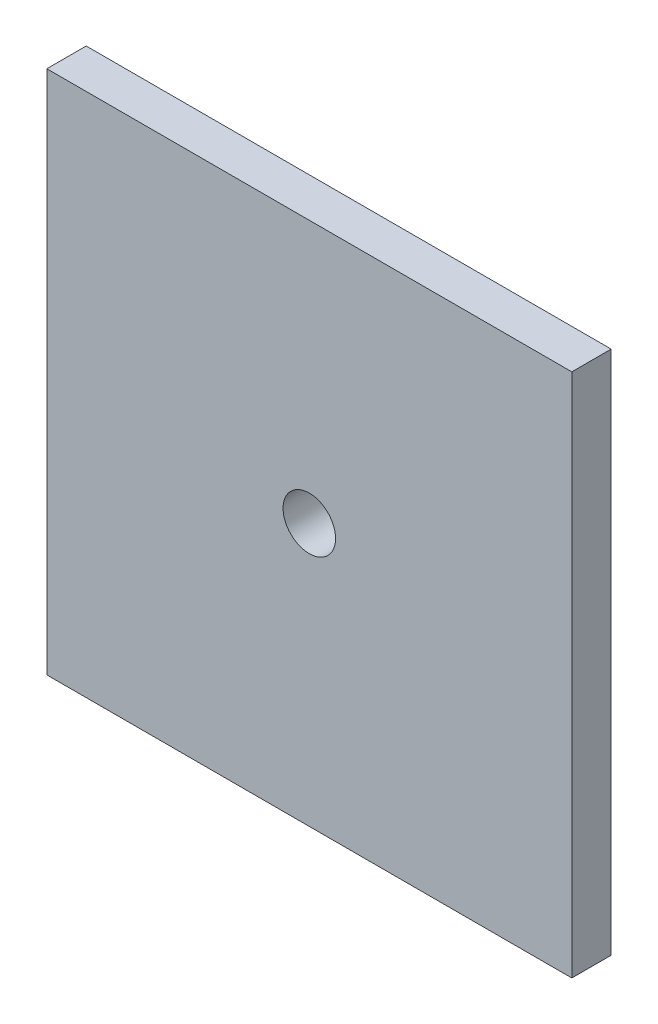
ISO-10303-21;
HEADER;
FILE_DESCRIPTION(('STEP AP214'),'2;1');
FILE_NAME('part.step','',(''),(''),'','','');
FILE_SCHEMA(('AUTOMOTIVE_DESIGN { 1 0 10303 214 1 1 1 1 }'));
ENDSEC;
DATA;
#1=APPLICATION_CONTEXT('core data for automotive mechanical design processes');
#2=APPLICATION_PROTOCOL_DEFINITION('international standard','automotive_design',2000,#1);
#3=PRODUCT_CONTEXT('',#1,'mechanical');
#4=PRODUCT('Part','Part','',(#3));
#5=PRODUCT_RELATED_PRODUCT_CATEGORY('part','',(#4));
#6=PRODUCT_DEFINITION_FORMATION('','',#4);
#7=PRODUCT_DEFINITION_CONTEXT('part definition',#1,'design');
#8=PRODUCT_DEFINITION('design','',#6,#7);
#9=PRODUCT_DEFINITION_SHAPE('','',#8);
#10=(LENGTH_UNIT() NAMED_UNIT(*) SI_UNIT(.MILLI.,.METRE.));
#11=(NAMED_UNIT(*) PLANE_ANGLE_UNIT() SI_UNIT($,.RADIAN.));
#12=(NAMED_UNIT(*) SI_UNIT($,.STERADIAN.) SOLID_ANGLE_UNIT());
#13=UNCERTAINTY_MEASURE_WITH_UNIT(LENGTH_MEASURE(1.E-05),#10,'distance_accuracy_value','');
#14=(GEOMETRIC_REPRESENTATION_CONTEXT(3) GLOBAL_UNCERTAINTY_ASSIGNED_CONTEXT((#13)) GLOBAL_UNIT_ASSIGNED_CONTEXT((#10,
#11,#12)) REPRESENTATION_CONTEXT('',''));
#15=CARTESIAN_POINT('',(0.,0.,0.));
#16=DIRECTION('',(0.,0.,1.));
#17=DIRECTION('',(1.,0.,0.));
#18=AXIS2_PLACEMENT_3D('',#15,#16,#17);
#19=CARTESIAN_POINT('',(40.,40.,6.));
#20=DIRECTION('',(-1.,0.,0.));
#21=DIRECTION('',(0.,-1.,0.));
#22=AXIS2_PLACEMENT_3D('',#19,#20,#21);
#23=PLANE('',#22);
#24=DIRECTION('',(0.,1.,0.));
#25=VECTOR('',#24,1.);
#26=CARTESIAN_POINT('',(40.,40.,0.));
#27=LINE('',#26,#25);
#28=CARTESIAN_POINT('',(40.,-40.,0.));
#29=VERTEX_POINT('',#28);
#30=CARTESIAN_POINT('',(40.,40.,0.));
#31=VERTEX_POINT('',#30);
#32=EDGE_CURVE('E95',#29,#31,#27,.T.);
#33=ORIENTED_EDGE('',*,*,#32,.T.);
#34=DIRECTION('',(0.,0.,-1.));
#35=VECTOR('',#34,1.);
#36=CARTESIAN_POINT('',(40.,40.,6.));
#37=LINE('',#36,#35);
#38=CARTESIAN_POINT('',(40.,40.,6.));
#39=VERTEX_POINT('',#38);
#40=EDGE_CURVE('E11',#39,#31,#37,.T.);
#41=ORIENTED_EDGE('',*,*,#40,.F.);
#42=DIRECTION('',(0.,1.,0.));
#43=VECTOR('',#42,1.);
#44=CARTESIAN_POINT('',(40.,40.,6.));
#45=LINE('',#44,#43);
#46=CARTESIAN_POINT('',(40.,-40.,6.));
#47=VERTEX_POINT('',#46);
#48=EDGE_CURVE('E83',#47,#39,#45,.T.);
#49=ORIENTED_EDGE('',*,*,#48,.F.);
#50=DIRECTION('',(0.,0.,-1.));
#51=VECTOR('',#50,1.);
#52=CARTESIAN_POINT('',(40.,-40.,6.));
#53=LINE('',#52,#51);
#54=EDGE_CURVE('E91',#47,#29,#53,.T.);
#55=ORIENTED_EDGE('',*,*,#54,.T.);
#56=EDGE_LOOP('',(#33,#41,#49,#55));
#57=FACE_BOUND('',#56,.T.);
#58=ADVANCED_FACE('F32',(#57),#23,.F.);
#59=CARTESIAN_POINT('',(-40.,40.,6.));
#60=DIRECTION('',(0.,-1.,0.));
#61=DIRECTION('',(0.,0.,-1.));
#62=AXIS2_PLACEMENT_3D('',#59,#60,#61);
#63=PLANE('',#62);
#64=DIRECTION('',(-1.,0.,0.));
#65=VECTOR('',#64,1.);
#66=CARTESIAN_POINT('',(-40.,40.,0.));
#67=LINE('',#66,#65);
#68=CARTESIAN_POINT('',(-40.,40.,0.));
#69=VERTEX_POINT('',#68);
#70=EDGE_CURVE('E87',#31,#69,#67,.T.);
#71=ORIENTED_EDGE('',*,*,#70,.T.);
#72=DIRECTION('',(0.,0.,-1.));
#73=VECTOR('',#72,1.);
#74=CARTESIAN_POINT('',(-40.,40.,6.));
#75=LINE('',#74,#73);
#76=CARTESIAN_POINT('',(-40.,40.,6.));
#77=VERTEX_POINT('',#76);
#78=EDGE_CURVE('E40',#77,#69,#75,.T.);
#79=ORIENTED_EDGE('',*,*,#78,.F.);
#80=DIRECTION('',(-1.,0.,0.));
#81=VECTOR('',#80,1.);
#82=CARTESIAN_POINT('',(-40.,40.,6.));
#83=LINE('',#82,#81);
#84=EDGE_CURVE('E78',#39,#77,#83,.T.);
#85=ORIENTED_EDGE('',*,*,#84,.F.);
#86=ORIENTED_EDGE('',*,*,#40,.T.);
#87=EDGE_LOOP('',(#71,#79,#85,#86));
#88=FACE_BOUND('',#87,.T.);
#89=ADVANCED_FACE('F86',(#88),#63,.F.);
#90=CARTESIAN_POINT('',(-40.,40.,6.));
#91=DIRECTION('',(1.,0.,0.));
#92=DIRECTION('',(0.,1.,0.));
#93=AXIS2_PLACEMENT_3D('',#90,#91,#92);
#94=PLANE('',#93);
#95=DIRECTION('',(0.,-1.,0.));
#96=VECTOR('',#95,1.);
#97=CARTESIAN_POINT('',(-40.,40.,0.));
#98=LINE('',#97,#96);
#99=CARTESIAN_POINT('',(-40.,-40.,0.));
#100=VERTEX_POINT('',#99);
#101=EDGE_CURVE('E65',#69,#100,#98,.T.);
#102=ORIENTED_EDGE('',*,*,#101,.T.);
#103=DIRECTION('',(0.,0.,-1.));
#104=VECTOR('',#103,1.);
#105=CARTESIAN_POINT('',(-40.,-40.,6.));
#106=LINE('',#105,#104);
#107=CARTESIAN_POINT('',(-40.,-40.,6.));
#108=VERTEX_POINT('',#107);
#109=EDGE_CURVE('E88',#108,#100,#106,.T.);
#110=ORIENTED_EDGE('',*,*,#109,.F.);
#111=DIRECTION('',(0.,-1.,0.));
#112=VECTOR('',#111,1.);
#113=CARTESIAN_POINT('',(-40.,40.,6.));
#114=LINE('',#113,#112);
#115=EDGE_CURVE('E81',#77,#108,#114,.T.);
#116=ORIENTED_EDGE('',*,*,#115,.F.);
#117=ORIENTED_EDGE('',*,*,#78,.T.);
#118=EDGE_LOOP('',(#102,#110,#116,#117));
#119=FACE_BOUND('',#118,.T.);
#120=ADVANCED_FACE('F89',(#119),#94,.F.);
#121=CARTESIAN_POINT('',(-40.,-40.,6.));
#122=DIRECTION('',(0.,1.,0.));
#123=DIRECTION('',(0.,0.,1.));
#124=AXIS2_PLACEMENT_3D('',#121,#122,#123);
#125=PLANE('',#124);
#126=DIRECTION('',(1.,0.,0.));
#127=VECTOR('',#126,1.);
#128=CARTESIAN_POINT('',(-40.,-40.,0.));
#129=LINE('',#128,#127);
#130=EDGE_CURVE('E71',#100,#29,#129,.T.);
#131=ORIENTED_EDGE('',*,*,#130,.T.);
#132=ORIENTED_EDGE('',*,*,#54,.F.);
#133=DIRECTION('',(1.,0.,0.));
#134=VECTOR('',#133,1.);
#135=CARTESIAN_POINT('',(-40.,-40.,6.));
#136=LINE('',#135,#134);
#137=EDGE_CURVE('E48',#108,#47,#136,.T.);
#138=ORIENTED_EDGE('',*,*,#137,.F.);
#139=ORIENTED_EDGE('',*,*,#109,.T.);
#140=EDGE_LOOP('',(#131,#132,#138,#139));
#141=FACE_BOUND('',#140,.T.);
#142=ADVANCED_FACE('F103',(#141),#125,.F.);
#143=CARTESIAN_POINT('',(0.,0.,6.));
#144=DIRECTION('',(0.,0.,1.));
#145=DIRECTION('',(1.,0.,0.));
#146=AXIS2_PLACEMENT_3D('',#143,#144,#145);
#147=PLANE('',#146);
#148=CARTESIAN_POINT('',(0.,0.,6.));
#149=DIRECTION('',(0.,0.,1.));
#150=DIRECTION('',(1.,0.,0.));
#151=AXIS2_PLACEMENT_3D('',#148,#149,#150);
#152=CIRCLE('',#151,4.);
#153=CARTESIAN_POINT('',(4.,0.,6.));
#154=VERTEX_POINT('',#153);
#155=EDGE_CURVE('E109',#154,#154,#152,.T.);
#156=ORIENTED_EDGE('',*,*,#155,.F.);
#157=EDGE_LOOP('',(#156));
#158=FACE_BOUND('',#157,.T.);
#159=ORIENTED_EDGE('',*,*,#48,.T.);
#160=ORIENTED_EDGE('',*,*,#84,.T.);
#161=ORIENTED_EDGE('',*,*,#115,.T.);
#162=ORIENTED_EDGE('',*,*,#137,.T.);
#163=EDGE_LOOP('',(#159,#160,#161,#162));
#164=FACE_BOUND('',#163,.T.);
#165=ADVANCED_FACE('F79',(#158,#164),#147,.T.);
#166=CARTESIAN_POINT('',(0.,0.,0.));
#167=DIRECTION('',(0.,0.,1.));
#168=DIRECTION('',(1.,0.,0.));
#169=AXIS2_PLACEMENT_3D('',#166,#167,#168);
#170=PLANE('',#169);
#171=CARTESIAN_POINT('',(0.,0.,0.));
#172=DIRECTION('',(0.,0.,1.));
#173=DIRECTION('',(1.,0.,0.));
#174=AXIS2_PLACEMENT_3D('',#171,#172,#173);
#175=CIRCLE('',#174,4.);
#176=CARTESIAN_POINT('',(4.,0.,0.));
#177=VERTEX_POINT('',#176);
#178=EDGE_CURVE('E98',#177,#177,#175,.T.);
#179=ORIENTED_EDGE('',*,*,#178,.T.);
#180=EDGE_LOOP('',(#179));
#181=FACE_BOUND('',#180,.T.);
#182=ORIENTED_EDGE('',*,*,#32,.F.);
#183=ORIENTED_EDGE('',*,*,#130,.F.);
#184=ORIENTED_EDGE('',*,*,#101,.F.);
#185=ORIENTED_EDGE('',*,*,#70,.F.);
#186=EDGE_LOOP('',(#182,#183,#184,#185));
#187=FACE_BOUND('',#186,.T.);
#188=ADVANCED_FACE('F106',(#181,#187),#170,.F.);
#189=CARTESIAN_POINT('',(0.,0.,0.));
#190=DIRECTION('',(0.,0.,1.));
#191=DIRECTION('',(1.,0.,0.));
#192=AXIS2_PLACEMENT_3D('',#189,#190,#191);
#193=CYLINDRICAL_SURFACE('',#192,4.);
#194=ORIENTED_EDGE('',*,*,#178,.F.);
#195=EDGE_LOOP('',(#194));
#196=FACE_BOUND('',#195,.T.);
#197=ORIENTED_EDGE('',*,*,#155,.T.);
#198=EDGE_LOOP('',(#197));
#199=FACE_BOUND('',#198,.T.);
#200=ADVANCED_FACE('F116',(#196,#199),#193,.F.);
#201=CLOSED_SHELL('',(#58,#89,#120,#142,#165,#188,#200));
#202=MANIFOLD_SOLID_BREP('B2',#201);
#203=ADVANCED_BREP_SHAPE_REPRESENTATION('',(#18,#202),#14);
#204=SHAPE_DEFINITION_REPRESENTATION(#9,#203);
ENDSEC;
END-ISO-10303-21;
